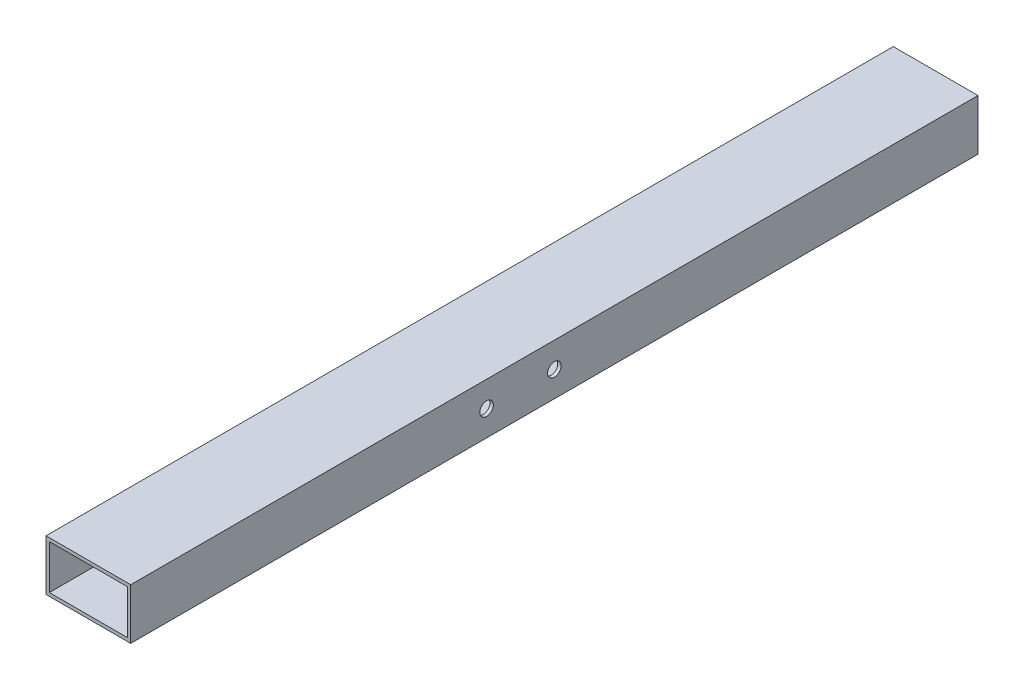
ISO-10303-21;
HEADER;
FILE_DESCRIPTION(('STEP AP214'),'2;1');
FILE_NAME('part.step','',(''),(''),'','','');
FILE_SCHEMA(('AUTOMOTIVE_DESIGN { 1 0 10303 214 1 1 1 1 }'));
ENDSEC;
DATA;
#1=APPLICATION_CONTEXT('core data for automotive mechanical design processes');
#2=APPLICATION_PROTOCOL_DEFINITION('international standard','automotive_design',2000,#1);
#3=PRODUCT_CONTEXT('',#1,'mechanical');
#4=PRODUCT('Part','Part','',(#3));
#5=PRODUCT_RELATED_PRODUCT_CATEGORY('part','',(#4));
#6=PRODUCT_DEFINITION_FORMATION('','',#4);
#7=PRODUCT_DEFINITION_CONTEXT('part definition',#1,'design');
#8=PRODUCT_DEFINITION('design','',#6,#7);
#9=PRODUCT_DEFINITION_SHAPE('','',#8);
#10=(LENGTH_UNIT() NAMED_UNIT(*) SI_UNIT(.MILLI.,.METRE.));
#11=(NAMED_UNIT(*) PLANE_ANGLE_UNIT() SI_UNIT($,.RADIAN.));
#12=(NAMED_UNIT(*) SI_UNIT($,.STERADIAN.) SOLID_ANGLE_UNIT());
#13=UNCERTAINTY_MEASURE_WITH_UNIT(LENGTH_MEASURE(1.E-05),#10,'distance_accuracy_value','');
#14=(GEOMETRIC_REPRESENTATION_CONTEXT(3) GLOBAL_UNCERTAINTY_ASSIGNED_CONTEXT((#13)) GLOBAL_UNIT_ASSIGNED_CONTEXT((#10,
#11,#12)) REPRESENTATION_CONTEXT('',''));
#15=CARTESIAN_POINT('',(0.,0.,0.));
#16=DIRECTION('',(0.,0.,1.));
#17=DIRECTION('',(1.,0.,0.));
#18=AXIS2_PLACEMENT_3D('',#15,#16,#17);
#19=CARTESIAN_POINT('',(0.,0.,500.));
#20=DIRECTION('',(0.,0.,1.));
#21=DIRECTION('',(1.,0.,0.));
#22=AXIS2_PLACEMENT_3D('',#19,#20,#21);
#23=PLANE('',#22);
#24=DIRECTION('',(0.,-1.,0.));
#25=VECTOR('',#24,1.);
#26=CARTESIAN_POINT('',(0.,0.,500.));
#27=LINE('',#26,#25);
#28=CARTESIAN_POINT('',(0.,0.,500.));
#29=VERTEX_POINT('',#28);
#30=CARTESIAN_POINT('',(0.,-30.,500.));
#31=VERTEX_POINT('',#30);
#32=EDGE_CURVE('E146',#29,#31,#27,.T.);
#33=ORIENTED_EDGE('',*,*,#32,.T.);
#34=DIRECTION('',(1.,0.,0.));
#35=VECTOR('',#34,1.);
#36=CARTESIAN_POINT('',(0.,-30.,500.));
#37=LINE('',#36,#35);
#38=CARTESIAN_POINT('',(50.,-30.,500.));
#39=VERTEX_POINT('',#38);
#40=EDGE_CURVE('E149',#31,#39,#37,.T.);
#41=ORIENTED_EDGE('',*,*,#40,.T.);
#42=DIRECTION('',(0.,1.,0.));
#43=VECTOR('',#42,1.);
#44=CARTESIAN_POINT('',(50.,0.,500.));
#45=LINE('',#44,#43);
#46=CARTESIAN_POINT('',(50.,0.,500.));
#47=VERTEX_POINT('',#46);
#48=EDGE_CURVE('E152',#39,#47,#45,.T.);
#49=ORIENTED_EDGE('',*,*,#48,.T.);
#50=DIRECTION('',(-1.,0.,0.));
#51=VECTOR('',#50,1.);
#52=CARTESIAN_POINT('',(0.,0.,500.));
#53=LINE('',#52,#51);
#54=EDGE_CURVE('E154',#47,#29,#53,.T.);
#55=ORIENTED_EDGE('',*,*,#54,.T.);
#56=EDGE_LOOP('',(#33,#41,#49,#55));
#57=FACE_BOUND('',#56,.T.);
#58=DIRECTION('',(1.,0.,0.));
#59=VECTOR('',#58,1.);
#60=CARTESIAN_POINT('',(2.,-28.,500.));
#61=LINE('',#60,#59);
#62=CARTESIAN_POINT('',(2.,-28.,500.));
#63=VERTEX_POINT('',#62);
#64=CARTESIAN_POINT('',(48.,-28.,500.));
#65=VERTEX_POINT('',#64);
#66=EDGE_CURVE('E116',#63,#65,#61,.T.);
#67=ORIENTED_EDGE('',*,*,#66,.F.);
#68=DIRECTION('',(0.,-1.,0.));
#69=VECTOR('',#68,1.);
#70=CARTESIAN_POINT('',(2.,-2.,500.));
#71=LINE('',#70,#69);
#72=CARTESIAN_POINT('',(2.,-2.,500.));
#73=VERTEX_POINT('',#72);
#74=EDGE_CURVE('E108',#73,#63,#71,.T.);
#75=ORIENTED_EDGE('',*,*,#74,.F.);
#76=DIRECTION('',(-1.,0.,0.));
#77=VECTOR('',#76,1.);
#78=CARTESIAN_POINT('',(2.,-2.,500.));
#79=LINE('',#78,#77);
#80=CARTESIAN_POINT('',(48.,-2.,500.));
#81=VERTEX_POINT('',#80);
#82=EDGE_CURVE('E130',#81,#73,#79,.T.);
#83=ORIENTED_EDGE('',*,*,#82,.F.);
#84=DIRECTION('',(0.,1.,0.));
#85=VECTOR('',#84,1.);
#86=CARTESIAN_POINT('',(48.,-2.,500.));
#87=LINE('',#86,#85);
#88=EDGE_CURVE('E128',#65,#81,#87,.T.);
#89=ORIENTED_EDGE('',*,*,#88,.F.);
#90=EDGE_LOOP('',(#67,#75,#83,#89));
#91=FACE_BOUND('',#90,.T.);
#92=ADVANCED_FACE('F41',(#57,#91),#23,.T.);
#93=CARTESIAN_POINT('',(0.,0.,0.));
#94=DIRECTION('',(0.,0.,1.));
#95=DIRECTION('',(1.,0.,0.));
#96=AXIS2_PLACEMENT_3D('',#93,#94,#95);
#97=PLANE('',#96);
#98=DIRECTION('',(0.,-1.,0.));
#99=VECTOR('',#98,1.);
#100=CARTESIAN_POINT('',(0.,0.,0.));
#101=LINE('',#100,#99);
#102=CARTESIAN_POINT('',(0.,0.,0.));
#103=VERTEX_POINT('',#102);
#104=CARTESIAN_POINT('',(0.,-30.,0.));
#105=VERTEX_POINT('',#104);
#106=EDGE_CURVE('E124',#103,#105,#101,.T.);
#107=ORIENTED_EDGE('',*,*,#106,.F.);
#108=DIRECTION('',(-1.,0.,0.));
#109=VECTOR('',#108,1.);
#110=CARTESIAN_POINT('',(0.,0.,0.));
#111=LINE('',#110,#109);
#112=CARTESIAN_POINT('',(50.,0.,0.));
#113=VERTEX_POINT('',#112);
#114=EDGE_CURVE('E150',#113,#103,#111,.T.);
#115=ORIENTED_EDGE('',*,*,#114,.F.);
#116=DIRECTION('',(0.,1.,0.));
#117=VECTOR('',#116,1.);
#118=CARTESIAN_POINT('',(50.,0.,0.));
#119=LINE('',#118,#117);
#120=CARTESIAN_POINT('',(50.,-30.,0.));
#121=VERTEX_POINT('',#120);
#122=EDGE_CURVE('E161',#121,#113,#119,.T.);
#123=ORIENTED_EDGE('',*,*,#122,.F.);
#124=DIRECTION('',(1.,0.,0.));
#125=VECTOR('',#124,1.);
#126=CARTESIAN_POINT('',(0.,-30.,0.));
#127=LINE('',#126,#125);
#128=EDGE_CURVE('E159',#105,#121,#127,.T.);
#129=ORIENTED_EDGE('',*,*,#128,.F.);
#130=EDGE_LOOP('',(#107,#115,#123,#129));
#131=FACE_BOUND('',#130,.T.);
#132=DIRECTION('',(0.,-1.,0.));
#133=VECTOR('',#132,1.);
#134=CARTESIAN_POINT('',(2.,-2.,0.));
#135=LINE('',#134,#133);
#136=CARTESIAN_POINT('',(2.,-2.,0.));
#137=VERTEX_POINT('',#136);
#138=CARTESIAN_POINT('',(2.,-28.,0.));
#139=VERTEX_POINT('',#138);
#140=EDGE_CURVE('E66',#137,#139,#135,.T.);
#141=ORIENTED_EDGE('',*,*,#140,.T.);
#142=DIRECTION('',(1.,0.,0.));
#143=VECTOR('',#142,1.);
#144=CARTESIAN_POINT('',(2.,-28.,0.));
#145=LINE('',#144,#143);
#146=CARTESIAN_POINT('',(48.,-28.,0.));
#147=VERTEX_POINT('',#146);
#148=EDGE_CURVE('E123',#139,#147,#145,.T.);
#149=ORIENTED_EDGE('',*,*,#148,.T.);
#150=DIRECTION('',(0.,1.,0.));
#151=VECTOR('',#150,1.);
#152=CARTESIAN_POINT('',(48.,-2.,0.));
#153=LINE('',#152,#151);
#154=CARTESIAN_POINT('',(48.,-2.,0.));
#155=VERTEX_POINT('',#154);
#156=EDGE_CURVE('E138',#147,#155,#153,.T.);
#157=ORIENTED_EDGE('',*,*,#156,.T.);
#158=DIRECTION('',(-1.,0.,0.));
#159=VECTOR('',#158,1.);
#160=CARTESIAN_POINT('',(2.,-2.,0.));
#161=LINE('',#160,#159);
#162=EDGE_CURVE('E117',#155,#137,#161,.T.);
#163=ORIENTED_EDGE('',*,*,#162,.T.);
#164=EDGE_LOOP('',(#141,#149,#157,#163));
#165=FACE_BOUND('',#164,.T.);
#166=ADVANCED_FACE('F208',(#131,#165),#97,.F.);
#167=CARTESIAN_POINT('',(0.,0.,500.));
#168=DIRECTION('',(1.,0.,0.));
#169=DIRECTION('',(0.,1.,0.));
#170=AXIS2_PLACEMENT_3D('',#167,#168,#169);
#171=PLANE('',#170);
#172=CARTESIAN_POINT('',(0.,-15.,290.));
#173=DIRECTION('',(1.,0.,0.));
#174=DIRECTION('',(0.,1.,0.));
#175=AXIS2_PLACEMENT_3D('',#172,#173,#174);
#176=CIRCLE('',#175,3.99999999999999);
#177=CARTESIAN_POINT('',(0.,-11.,290.));
#178=VERTEX_POINT('',#177);
#179=EDGE_CURVE('E173',#178,#178,#176,.T.);
#180=ORIENTED_EDGE('',*,*,#179,.T.);
#181=EDGE_LOOP('',(#180));
#182=FACE_BOUND('',#181,.T.);
#183=CARTESIAN_POINT('',(0.,-15.,250.));
#184=DIRECTION('',(1.,0.,0.));
#185=DIRECTION('',(0.,1.,0.));
#186=AXIS2_PLACEMENT_3D('',#183,#184,#185);
#187=CIRCLE('',#186,3.99999999999999);
#188=CARTESIAN_POINT('',(0.,-11.,250.));
#189=VERTEX_POINT('',#188);
#190=EDGE_CURVE('E184',#189,#189,#187,.T.);
#191=ORIENTED_EDGE('',*,*,#190,.T.);
#192=EDGE_LOOP('',(#191));
#193=FACE_BOUND('',#192,.T.);
#194=ORIENTED_EDGE('',*,*,#106,.T.);
#195=DIRECTION('',(0.,0.,-1.));
#196=VECTOR('',#195,1.);
#197=CARTESIAN_POINT('',(0.,-30.,500.));
#198=LINE('',#197,#196);
#199=EDGE_CURVE('E11',#31,#105,#198,.T.);
#200=ORIENTED_EDGE('',*,*,#199,.F.);
#201=ORIENTED_EDGE('',*,*,#32,.F.);
#202=DIRECTION('',(0.,0.,-1.));
#203=VECTOR('',#202,1.);
#204=CARTESIAN_POINT('',(0.,0.,500.));
#205=LINE('',#204,#203);
#206=EDGE_CURVE('E156',#29,#103,#205,.T.);
#207=ORIENTED_EDGE('',*,*,#206,.T.);
#208=EDGE_LOOP('',(#194,#200,#201,#207));
#209=FACE_BOUND('',#208,.T.);
#210=ADVANCED_FACE('F43',(#182,#193,#209),#171,.F.);
#211=CARTESIAN_POINT('',(0.,-30.,500.));
#212=DIRECTION('',(0.,1.,0.));
#213=DIRECTION('',(0.,0.,1.));
#214=AXIS2_PLACEMENT_3D('',#211,#212,#213);
#215=PLANE('',#214);
#216=ORIENTED_EDGE('',*,*,#128,.T.);
#217=DIRECTION('',(0.,0.,-1.));
#218=VECTOR('',#217,1.);
#219=CARTESIAN_POINT('',(50.,-30.,500.));
#220=LINE('',#219,#218);
#221=EDGE_CURVE('E50',#39,#121,#220,.T.);
#222=ORIENTED_EDGE('',*,*,#221,.F.);
#223=ORIENTED_EDGE('',*,*,#40,.F.);
#224=ORIENTED_EDGE('',*,*,#199,.T.);
#225=EDGE_LOOP('',(#216,#222,#223,#224));
#226=FACE_BOUND('',#225,.T.);
#227=ADVANCED_FACE('F236',(#226),#215,.F.);
#228=CARTESIAN_POINT('',(50.,0.,500.));
#229=DIRECTION('',(-1.,0.,0.));
#230=DIRECTION('',(0.,-1.,0.));
#231=AXIS2_PLACEMENT_3D('',#228,#229,#230);
#232=PLANE('',#231);
#233=CARTESIAN_POINT('',(50.,-15.,290.));
#234=DIRECTION('',(1.,0.,0.));
#235=DIRECTION('',(0.,1.,0.));
#236=AXIS2_PLACEMENT_3D('',#233,#234,#235);
#237=CIRCLE('',#236,3.99999999999999);
#238=CARTESIAN_POINT('',(50.,-11.,290.));
#239=VERTEX_POINT('',#238);
#240=EDGE_CURVE('E179',#239,#239,#237,.T.);
#241=ORIENTED_EDGE('',*,*,#240,.F.);
#242=EDGE_LOOP('',(#241));
#243=FACE_BOUND('',#242,.T.);
#244=CARTESIAN_POINT('',(50.,-15.,250.));
#245=DIRECTION('',(1.,0.,0.));
#246=DIRECTION('',(0.,1.,0.));
#247=AXIS2_PLACEMENT_3D('',#244,#245,#246);
#248=CIRCLE('',#247,3.99999999999999);
#249=CARTESIAN_POINT('',(50.,-11.,250.));
#250=VERTEX_POINT('',#249);
#251=EDGE_CURVE('E189',#250,#250,#248,.T.);
#252=ORIENTED_EDGE('',*,*,#251,.F.);
#253=EDGE_LOOP('',(#252));
#254=FACE_BOUND('',#253,.T.);
#255=ORIENTED_EDGE('',*,*,#122,.T.);
#256=DIRECTION('',(0.,0.,-1.));
#257=VECTOR('',#256,1.);
#258=CARTESIAN_POINT('',(50.,0.,500.));
#259=LINE('',#258,#257);
#260=EDGE_CURVE('E166',#47,#113,#259,.T.);
#261=ORIENTED_EDGE('',*,*,#260,.F.);
#262=ORIENTED_EDGE('',*,*,#48,.F.);
#263=ORIENTED_EDGE('',*,*,#221,.T.);
#264=EDGE_LOOP('',(#255,#261,#262,#263));
#265=FACE_BOUND('',#264,.T.);
#266=ADVANCED_FACE('F233',(#243,#254,#265),#232,.F.);
#267=CARTESIAN_POINT('',(0.,0.,500.));
#268=DIRECTION('',(0.,-1.,0.));
#269=DIRECTION('',(0.,0.,-1.));
#270=AXIS2_PLACEMENT_3D('',#267,#268,#269);
#271=PLANE('',#270);
#272=ORIENTED_EDGE('',*,*,#114,.T.);
#273=ORIENTED_EDGE('',*,*,#206,.F.);
#274=ORIENTED_EDGE('',*,*,#54,.F.);
#275=ORIENTED_EDGE('',*,*,#260,.T.);
#276=EDGE_LOOP('',(#272,#273,#274,#275));
#277=FACE_BOUND('',#276,.T.);
#278=ADVANCED_FACE('F230',(#277),#271,.F.);
#279=CARTESIAN_POINT('',(2.,-2.,500.));
#280=DIRECTION('',(1.,0.,0.));
#281=DIRECTION('',(0.,1.,0.));
#282=AXIS2_PLACEMENT_3D('',#279,#280,#281);
#283=PLANE('',#282);
#284=CARTESIAN_POINT('',(2.,-15.,290.));
#285=DIRECTION('',(1.,0.,0.));
#286=DIRECTION('',(0.,1.,0.));
#287=AXIS2_PLACEMENT_3D('',#284,#285,#286);
#288=CIRCLE('',#287,3.99999999999999);
#289=CARTESIAN_POINT('',(2.,-11.,290.));
#290=VERTEX_POINT('',#289);
#291=EDGE_CURVE('E136',#290,#290,#288,.T.);
#292=ORIENTED_EDGE('',*,*,#291,.F.);
#293=EDGE_LOOP('',(#292));
#294=FACE_BOUND('',#293,.T.);
#295=CARTESIAN_POINT('',(2.,-15.,250.));
#296=DIRECTION('',(1.,0.,0.));
#297=DIRECTION('',(0.,1.,0.));
#298=AXIS2_PLACEMENT_3D('',#295,#296,#297);
#299=CIRCLE('',#298,3.99999999999999);
#300=CARTESIAN_POINT('',(2.,-11.,250.));
#301=VERTEX_POINT('',#300);
#302=EDGE_CURVE('E172',#301,#301,#299,.T.);
#303=ORIENTED_EDGE('',*,*,#302,.F.);
#304=EDGE_LOOP('',(#303));
#305=FACE_BOUND('',#304,.T.);
#306=ORIENTED_EDGE('',*,*,#140,.F.);
#307=DIRECTION('',(0.,0.,-1.));
#308=VECTOR('',#307,1.);
#309=CARTESIAN_POINT('',(2.,-2.,500.));
#310=LINE('',#309,#308);
#311=EDGE_CURVE('E112',#73,#137,#310,.T.);
#312=ORIENTED_EDGE('',*,*,#311,.F.);
#313=ORIENTED_EDGE('',*,*,#74,.T.);
#314=DIRECTION('',(0.,0.,-1.));
#315=VECTOR('',#314,1.);
#316=CARTESIAN_POINT('',(2.,-28.,500.));
#317=LINE('',#316,#315);
#318=EDGE_CURVE('E111',#63,#139,#317,.T.);
#319=ORIENTED_EDGE('',*,*,#318,.T.);
#320=EDGE_LOOP('',(#306,#312,#313,#319));
#321=FACE_BOUND('',#320,.T.);
#322=ADVANCED_FACE('F110',(#294,#305,#321),#283,.T.);
#323=CARTESIAN_POINT('',(2.,-28.,500.));
#324=DIRECTION('',(0.,1.,0.));
#325=DIRECTION('',(0.,0.,1.));
#326=AXIS2_PLACEMENT_3D('',#323,#324,#325);
#327=PLANE('',#326);
#328=ORIENTED_EDGE('',*,*,#148,.F.);
#329=ORIENTED_EDGE('',*,*,#318,.F.);
#330=ORIENTED_EDGE('',*,*,#66,.T.);
#331=DIRECTION('',(0.,0.,-1.));
#332=VECTOR('',#331,1.);
#333=CARTESIAN_POINT('',(48.,-28.,500.));
#334=LINE('',#333,#332);
#335=EDGE_CURVE('E125',#65,#147,#334,.T.);
#336=ORIENTED_EDGE('',*,*,#335,.T.);
#337=EDGE_LOOP('',(#328,#329,#330,#336));
#338=FACE_BOUND('',#337,.T.);
#339=ADVANCED_FACE('F120',(#338),#327,.T.);
#340=CARTESIAN_POINT('',(48.,-2.,500.));
#341=DIRECTION('',(-1.,0.,0.));
#342=DIRECTION('',(0.,0.,1.));
#343=AXIS2_PLACEMENT_3D('',#340,#341,#342);
#344=PLANE('',#343);
#345=CARTESIAN_POINT('',(48.,-15.,290.));
#346=DIRECTION('',(-1.,0.,0.));
#347=DIRECTION('',(0.,0.,1.));
#348=AXIS2_PLACEMENT_3D('',#345,#346,#347);
#349=CIRCLE('',#348,3.99999999999999);
#350=CARTESIAN_POINT('',(48.,-15.,294.));
#351=VERTEX_POINT('',#350);
#352=EDGE_CURVE('E45',#351,#351,#349,.T.);
#353=ORIENTED_EDGE('',*,*,#352,.F.);
#354=EDGE_LOOP('',(#353));
#355=FACE_BOUND('',#354,.T.);
#356=CARTESIAN_POINT('',(48.,-15.,250.));
#357=DIRECTION('',(-1.,0.,0.));
#358=DIRECTION('',(0.,0.,1.));
#359=AXIS2_PLACEMENT_3D('',#356,#357,#358);
#360=CIRCLE('',#359,3.99999999999999);
#361=CARTESIAN_POINT('',(48.,-15.,254.));
#362=VERTEX_POINT('',#361);
#363=EDGE_CURVE('E170',#362,#362,#360,.T.);
#364=ORIENTED_EDGE('',*,*,#363,.F.);
#365=EDGE_LOOP('',(#364));
#366=FACE_BOUND('',#365,.T.);
#367=ORIENTED_EDGE('',*,*,#156,.F.);
#368=ORIENTED_EDGE('',*,*,#335,.F.);
#369=ORIENTED_EDGE('',*,*,#88,.T.);
#370=DIRECTION('',(0.,0.,-1.));
#371=VECTOR('',#370,1.);
#372=CARTESIAN_POINT('',(48.,-2.,500.));
#373=LINE('',#372,#371);
#374=EDGE_CURVE('E58',#81,#155,#373,.T.);
#375=ORIENTED_EDGE('',*,*,#374,.T.);
#376=EDGE_LOOP('',(#367,#368,#369,#375));
#377=FACE_BOUND('',#376,.T.);
#378=ADVANCED_FACE('F200',(#355,#366,#377),#344,.T.);
#379=CARTESIAN_POINT('',(2.,-2.,500.));
#380=DIRECTION('',(0.,-1.,0.));
#381=DIRECTION('',(0.,0.,-1.));
#382=AXIS2_PLACEMENT_3D('',#379,#380,#381);
#383=PLANE('',#382);
#384=ORIENTED_EDGE('',*,*,#162,.F.);
#385=ORIENTED_EDGE('',*,*,#374,.F.);
#386=ORIENTED_EDGE('',*,*,#82,.T.);
#387=ORIENTED_EDGE('',*,*,#311,.T.);
#388=EDGE_LOOP('',(#384,#385,#386,#387));
#389=FACE_BOUND('',#388,.T.);
#390=ADVANCED_FACE('F203',(#389),#383,.T.);
#391=CARTESIAN_POINT('',(0.,-15.,250.));
#392=DIRECTION('',(1.,0.,0.));
#393=DIRECTION('',(0.,1.,0.));
#394=AXIS2_PLACEMENT_3D('',#391,#392,#393);
#395=CYLINDRICAL_SURFACE('',#394,3.99999999999999);
#396=ORIENTED_EDGE('',*,*,#363,.T.);
#397=EDGE_LOOP('',(#396));
#398=FACE_BOUND('',#397,.T.);
#399=ORIENTED_EDGE('',*,*,#251,.T.);
#400=EDGE_LOOP('',(#399));
#401=FACE_BOUND('',#400,.T.);
#402=ADVANCED_FACE('F210',(#398,#401),#395,.F.);
#403=CARTESIAN_POINT('',(0.,-15.,290.));
#404=DIRECTION('',(1.,0.,0.));
#405=DIRECTION('',(0.,1.,0.));
#406=AXIS2_PLACEMENT_3D('',#403,#404,#405);
#407=CYLINDRICAL_SURFACE('',#406,3.99999999999999);
#408=ORIENTED_EDGE('',*,*,#352,.T.);
#409=EDGE_LOOP('',(#408));
#410=FACE_BOUND('',#409,.T.);
#411=ORIENTED_EDGE('',*,*,#240,.T.);
#412=EDGE_LOOP('',(#411));
#413=FACE_BOUND('',#412,.T.);
#414=ADVANCED_FACE('F197',(#410,#413),#407,.F.);
#415=ORIENTED_EDGE('',*,*,#302,.T.);
#416=EDGE_LOOP('',(#415));
#417=FACE_BOUND('',#416,.T.);
#418=ORIENTED_EDGE('',*,*,#190,.F.);
#419=EDGE_LOOP('',(#418));
#420=FACE_BOUND('',#419,.T.);
#421=ADVANCED_FACE('F218',(#417,#420),#395,.F.);
#422=ORIENTED_EDGE('',*,*,#291,.T.);
#423=EDGE_LOOP('',(#422));
#424=FACE_BOUND('',#423,.T.);
#425=ORIENTED_EDGE('',*,*,#179,.F.);
#426=EDGE_LOOP('',(#425));
#427=FACE_BOUND('',#426,.T.);
#428=ADVANCED_FACE('F260',(#424,#427),#407,.F.);
#429=CLOSED_SHELL('',(#92,#166,#210,#227,#266,#278,#322,#339,#378,#390,#402,#414,#421,#428));
#430=MANIFOLD_SOLID_BREP('B2',#429);
#431=ADVANCED_BREP_SHAPE_REPRESENTATION('',(#18,#430),#14);
#432=SHAPE_DEFINITION_REPRESENTATION(#9,#431);
ENDSEC;
END-ISO-10303-21;
